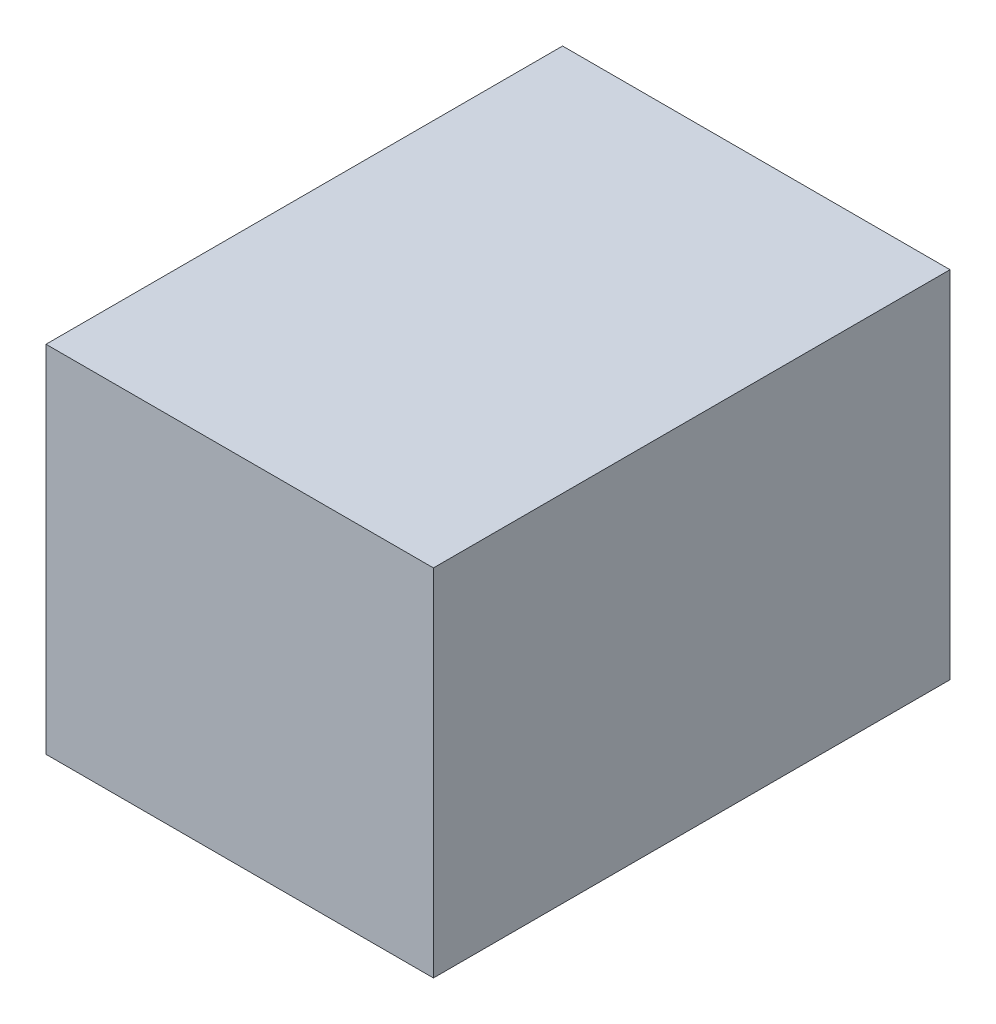
ISO-10303-21;
HEADER;
FILE_DESCRIPTION(('STEP AP214'),'2;1');
FILE_NAME('part.step','',(''),(''),'','','');
FILE_SCHEMA(('AUTOMOTIVE_DESIGN { 1 0 10303 214 1 1 1 1 }'));
ENDSEC;
DATA;
#1=APPLICATION_CONTEXT('core data for automotive mechanical design processes');
#2=APPLICATION_PROTOCOL_DEFINITION('international standard','automotive_design',2000,#1);
#3=PRODUCT_CONTEXT('',#1,'mechanical');
#4=PRODUCT('Part','Part','',(#3));
#5=PRODUCT_RELATED_PRODUCT_CATEGORY('part','',(#4));
#6=PRODUCT_DEFINITION_FORMATION('','',#4);
#7=PRODUCT_DEFINITION_CONTEXT('part definition',#1,'design');
#8=PRODUCT_DEFINITION('design','',#6,#7);
#9=PRODUCT_DEFINITION_SHAPE('','',#8);
#10=(LENGTH_UNIT() NAMED_UNIT(*) SI_UNIT(.MILLI.,.METRE.));
#11=(NAMED_UNIT(*) PLANE_ANGLE_UNIT() SI_UNIT($,.RADIAN.));
#12=(NAMED_UNIT(*) SI_UNIT($,.STERADIAN.) SOLID_ANGLE_UNIT());
#13=UNCERTAINTY_MEASURE_WITH_UNIT(LENGTH_MEASURE(1.E-05),#10,'distance_accuracy_value','');
#14=(GEOMETRIC_REPRESENTATION_CONTEXT(3) GLOBAL_UNCERTAINTY_ASSIGNED_CONTEXT((#13)) GLOBAL_UNIT_ASSIGNED_CONTEXT((#10,
#11,#12)) REPRESENTATION_CONTEXT('',''));
#15=CARTESIAN_POINT('',(0.,0.,0.));
#16=DIRECTION('',(0.,0.,1.));
#17=DIRECTION('',(1.,0.,0.));
#18=AXIS2_PLACEMENT_3D('',#15,#16,#17);
#19=CARTESIAN_POINT('',(0.,5.5,0.));
#20=DIRECTION('',(1.,0.,0.));
#21=DIRECTION('',(0.,0.,-1.));
#22=AXIS2_PLACEMENT_3D('',#19,#20,#21);
#23=PLANE('',#22);
#24=DIRECTION('',(0.,0.,1.));
#25=VECTOR('',#24,1.);
#26=CARTESIAN_POINT('',(0.,0.,0.));
#27=LINE('',#26,#25);
#28=CARTESIAN_POINT('',(0.,0.,-8.));
#29=VERTEX_POINT('',#28);
#30=CARTESIAN_POINT('',(0.,0.,0.));
#31=VERTEX_POINT('',#30);
#32=EDGE_CURVE('E96',#29,#31,#27,.T.);
#33=ORIENTED_EDGE('',*,*,#32,.T.);
#34=DIRECTION('',(0.,-1.,0.));
#35=VECTOR('',#34,1.);
#36=CARTESIAN_POINT('',(0.,5.5,0.));
#37=LINE('',#36,#35);
#38=CARTESIAN_POINT('',(0.,5.5,0.));
#39=VERTEX_POINT('',#38);
#40=EDGE_CURVE('E11',#39,#31,#37,.T.);
#41=ORIENTED_EDGE('',*,*,#40,.F.);
#42=DIRECTION('',(0.,0.,1.));
#43=VECTOR('',#42,1.);
#44=CARTESIAN_POINT('',(0.,5.5,0.));
#45=LINE('',#44,#43);
#46=CARTESIAN_POINT('',(0.,5.5,-8.));
#47=VERTEX_POINT('',#46);
#48=EDGE_CURVE('E84',#47,#39,#45,.T.);
#49=ORIENTED_EDGE('',*,*,#48,.F.);
#50=DIRECTION('',(0.,-1.,0.));
#51=VECTOR('',#50,1.);
#52=CARTESIAN_POINT('',(0.,5.5,-8.));
#53=LINE('',#52,#51);
#54=EDGE_CURVE('E92',#47,#29,#53,.T.);
#55=ORIENTED_EDGE('',*,*,#54,.T.);
#56=EDGE_LOOP('',(#33,#41,#49,#55));
#57=FACE_BOUND('',#56,.T.);
#58=ADVANCED_FACE('F33',(#57),#23,.F.);
#59=CARTESIAN_POINT('',(0.,5.5,0.));
#60=DIRECTION('',(0.,0.,-1.));
#61=DIRECTION('',(-1.,0.,0.));
#62=AXIS2_PLACEMENT_3D('',#59,#60,#61);
#63=PLANE('',#62);
#64=DIRECTION('',(1.,0.,0.));
#65=VECTOR('',#64,1.);
#66=CARTESIAN_POINT('',(0.,0.,0.));
#67=LINE('',#66,#65);
#68=CARTESIAN_POINT('',(6.,0.,0.));
#69=VERTEX_POINT('',#68);
#70=EDGE_CURVE('E88',#31,#69,#67,.T.);
#71=ORIENTED_EDGE('',*,*,#70,.T.);
#72=DIRECTION('',(0.,-1.,0.));
#73=VECTOR('',#72,1.);
#74=CARTESIAN_POINT('',(6.,5.5,0.));
#75=LINE('',#74,#73);
#76=CARTESIAN_POINT('',(6.,5.5,0.));
#77=VERTEX_POINT('',#76);
#78=EDGE_CURVE('E41',#77,#69,#75,.T.);
#79=ORIENTED_EDGE('',*,*,#78,.F.);
#80=DIRECTION('',(1.,0.,0.));
#81=VECTOR('',#80,1.);
#82=CARTESIAN_POINT('',(0.,5.5,0.));
#83=LINE('',#82,#81);
#84=EDGE_CURVE('E79',#39,#77,#83,.T.);
#85=ORIENTED_EDGE('',*,*,#84,.F.);
#86=ORIENTED_EDGE('',*,*,#40,.T.);
#87=EDGE_LOOP('',(#71,#79,#85,#86));
#88=FACE_BOUND('',#87,.T.);
#89=ADVANCED_FACE('F87',(#88),#63,.F.);
#90=CARTESIAN_POINT('',(6.,5.5,0.));
#91=DIRECTION('',(-1.,0.,0.));
#92=DIRECTION('',(0.,0.,1.));
#93=AXIS2_PLACEMENT_3D('',#90,#91,#92);
#94=PLANE('',#93);
#95=DIRECTION('',(0.,0.,-1.));
#96=VECTOR('',#95,1.);
#97=CARTESIAN_POINT('',(6.,0.,0.));
#98=LINE('',#97,#96);
#99=CARTESIAN_POINT('',(6.,0.,-8.));
#100=VERTEX_POINT('',#99);
#101=EDGE_CURVE('E66',#69,#100,#98,.T.);
#102=ORIENTED_EDGE('',*,*,#101,.T.);
#103=DIRECTION('',(0.,-1.,0.));
#104=VECTOR('',#103,1.);
#105=CARTESIAN_POINT('',(6.,5.5,-8.));
#106=LINE('',#105,#104);
#107=CARTESIAN_POINT('',(6.,5.5,-8.));
#108=VERTEX_POINT('',#107);
#109=EDGE_CURVE('E89',#108,#100,#106,.T.);
#110=ORIENTED_EDGE('',*,*,#109,.F.);
#111=DIRECTION('',(0.,0.,-1.));
#112=VECTOR('',#111,1.);
#113=CARTESIAN_POINT('',(6.,5.5,0.));
#114=LINE('',#113,#112);
#115=EDGE_CURVE('E82',#77,#108,#114,.T.);
#116=ORIENTED_EDGE('',*,*,#115,.F.);
#117=ORIENTED_EDGE('',*,*,#78,.T.);
#118=EDGE_LOOP('',(#102,#110,#116,#117));
#119=FACE_BOUND('',#118,.T.);
#120=ADVANCED_FACE('F90',(#119),#94,.F.);
#121=CARTESIAN_POINT('',(0.,5.5,-8.));
#122=DIRECTION('',(0.,0.,1.));
#123=DIRECTION('',(1.,0.,0.));
#124=AXIS2_PLACEMENT_3D('',#121,#122,#123);
#125=PLANE('',#124);
#126=DIRECTION('',(-1.,0.,0.));
#127=VECTOR('',#126,1.);
#128=CARTESIAN_POINT('',(0.,0.,-8.));
#129=LINE('',#128,#127);
#130=EDGE_CURVE('E72',#100,#29,#129,.T.);
#131=ORIENTED_EDGE('',*,*,#130,.T.);
#132=ORIENTED_EDGE('',*,*,#54,.F.);
#133=DIRECTION('',(-1.,0.,0.));
#134=VECTOR('',#133,1.);
#135=CARTESIAN_POINT('',(0.,5.5,-8.));
#136=LINE('',#135,#134);
#137=EDGE_CURVE('E49',#108,#47,#136,.T.);
#138=ORIENTED_EDGE('',*,*,#137,.F.);
#139=ORIENTED_EDGE('',*,*,#109,.T.);
#140=EDGE_LOOP('',(#131,#132,#138,#139));
#141=FACE_BOUND('',#140,.T.);
#142=ADVANCED_FACE('F103',(#141),#125,.F.);
#143=CARTESIAN_POINT('',(0.,5.5,0.));
#144=DIRECTION('',(0.,-1.,0.));
#145=DIRECTION('',(0.,0.,-1.));
#146=AXIS2_PLACEMENT_3D('',#143,#144,#145);
#147=PLANE('',#146);
#148=ORIENTED_EDGE('',*,*,#48,.T.);
#149=ORIENTED_EDGE('',*,*,#84,.T.);
#150=ORIENTED_EDGE('',*,*,#115,.T.);
#151=ORIENTED_EDGE('',*,*,#137,.T.);
#152=EDGE_LOOP('',(#148,#149,#150,#151));
#153=FACE_BOUND('',#152,.T.);
#154=ADVANCED_FACE('F80',(#153),#147,.F.);
#155=CARTESIAN_POINT('',(0.,0.,0.));
#156=DIRECTION('',(0.,-1.,0.));
#157=DIRECTION('',(0.,0.,-1.));
#158=AXIS2_PLACEMENT_3D('',#155,#156,#157);
#159=PLANE('',#158);
#160=ORIENTED_EDGE('',*,*,#32,.F.);
#161=ORIENTED_EDGE('',*,*,#130,.F.);
#162=ORIENTED_EDGE('',*,*,#101,.F.);
#163=ORIENTED_EDGE('',*,*,#70,.F.);
#164=EDGE_LOOP('',(#160,#161,#162,#163));
#165=FACE_BOUND('',#164,.T.);
#166=ADVANCED_FACE('F106',(#165),#159,.T.);
#167=CLOSED_SHELL('',(#58,#89,#120,#142,#154,#166));
#168=MANIFOLD_SOLID_BREP('B2',#167);
#169=ADVANCED_BREP_SHAPE_REPRESENTATION('',(#18,#168),#14);
#170=SHAPE_DEFINITION_REPRESENTATION(#9,#169);
ENDSEC;
END-ISO-10303-21;
